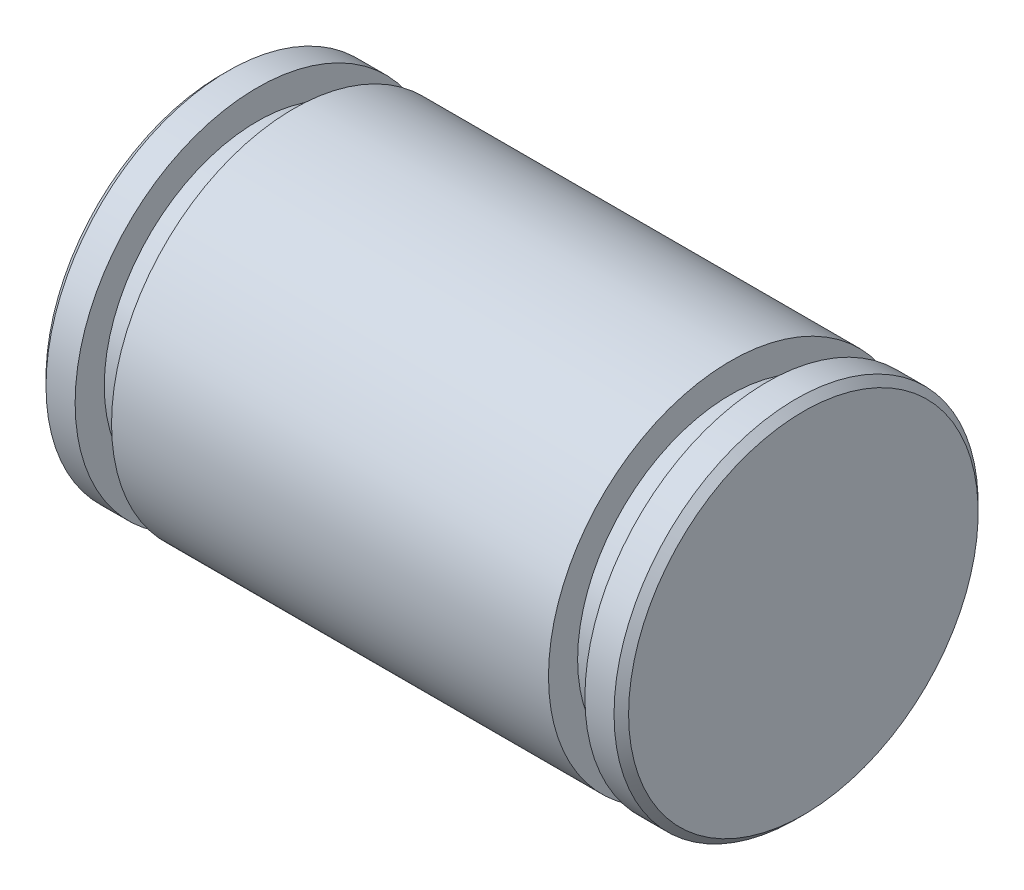
ISO-10303-21;
HEADER;
FILE_DESCRIPTION(('STEP AP214'),'2;1');
FILE_NAME('part.step','',(''),(''),'','','');
FILE_SCHEMA(('AUTOMOTIVE_DESIGN { 1 0 10303 214 1 1 1 1 }'));
ENDSEC;
DATA;
#1=APPLICATION_CONTEXT('core data for automotive mechanical design processes');
#2=APPLICATION_PROTOCOL_DEFINITION('international standard','automotive_design',2000,#1);
#3=PRODUCT_CONTEXT('',#1,'mechanical');
#4=PRODUCT('Part','Part','',(#3));
#5=PRODUCT_RELATED_PRODUCT_CATEGORY('part','',(#4));
#6=PRODUCT_DEFINITION_FORMATION('','',#4);
#7=PRODUCT_DEFINITION_CONTEXT('part definition',#1,'design');
#8=PRODUCT_DEFINITION('design','',#6,#7);
#9=PRODUCT_DEFINITION_SHAPE('','',#8);
#10=(LENGTH_UNIT() NAMED_UNIT(*) SI_UNIT(.MILLI.,.METRE.));
#11=(NAMED_UNIT(*) PLANE_ANGLE_UNIT() SI_UNIT($,.RADIAN.));
#12=(NAMED_UNIT(*) SI_UNIT($,.STERADIAN.) SOLID_ANGLE_UNIT());
#13=UNCERTAINTY_MEASURE_WITH_UNIT(LENGTH_MEASURE(1.E-05),#10,'distance_accuracy_value','');
#14=(GEOMETRIC_REPRESENTATION_CONTEXT(3) GLOBAL_UNCERTAINTY_ASSIGNED_CONTEXT((#13)) GLOBAL_UNIT_ASSIGNED_CONTEXT((#10,
#11,#12)) REPRESENTATION_CONTEXT('',''));
#15=CARTESIAN_POINT('',(0.,0.,0.));
#16=DIRECTION('',(0.,0.,1.));
#17=DIRECTION('',(1.,0.,0.));
#18=AXIS2_PLACEMENT_3D('',#15,#16,#17);
#19=CARTESIAN_POINT('',(16.,4.8,0.));
#20=DIRECTION('',(-1.,0.,0.));
#21=DIRECTION('',(0.,0.,1.));
#22=AXIS2_PLACEMENT_3D('',#19,#20,#21);
#23=PLANE('',#22);
#24=CARTESIAN_POINT('',(15.9999999999627,0.,0.));
#25=DIRECTION('',(-1.,0.,0.));
#26=DIRECTION('',(0.,0.,1.));
#27=AXIS2_PLACEMENT_3D('',#24,#25,#26);
#28=CIRCLE('',#27,4.80000000004566);
#29=CARTESIAN_POINT('',(15.9999999999627,0.,4.80000000004566));
#30=VERTEX_POINT('',#29);
#31=EDGE_CURVE('E17',#30,#30,#28,.T.);
#32=ORIENTED_EDGE('',*,*,#31,.F.);
#33=EDGE_LOOP('',(#32));
#34=FACE_BOUND('',#33,.T.);
#35=ADVANCED_FACE('F14',(#34),#23,.F.);
#36=CARTESIAN_POINT('',(0.,0.,0.));
#37=DIRECTION('',(1.,0.,0.));
#38=DIRECTION('',(0.,0.,-1.));
#39=AXIS2_PLACEMENT_3D('',#36,#37,#38);
#40=PLANE('',#39);
#41=CARTESIAN_POINT('',(5.6843418860808E-11,0.,0.));
#42=DIRECTION('',(1.,0.,0.));
#43=DIRECTION('',(0.,0.,-1.));
#44=AXIS2_PLACEMENT_3D('',#41,#42,#43);
#45=CIRCLE('',#44,4.79999999998881);
#46=CARTESIAN_POINT('',(5.6843418860808E-11,0.,-4.79999999998881));
#47=VERTEX_POINT('',#46);
#48=EDGE_CURVE('E49',#47,#47,#45,.T.);
#49=ORIENTED_EDGE('',*,*,#48,.F.);
#50=EDGE_LOOP('',(#49));
#51=FACE_BOUND('',#50,.T.);
#52=ADVANCED_FACE('F60',(#51),#40,.F.);
#53=CARTESIAN_POINT('',(15.7999999999561,0.,0.));
#54=DIRECTION('',(-1.,0.,0.));
#55=DIRECTION('',(0.,0.,1.));
#56=AXIS2_PLACEMENT_3D('',#53,#54,#55);
#57=CONICAL_SURFACE('',#56,5.0000000000523,0.785398163397448);
#58=CARTESIAN_POINT('',(15.8,0.,0.));
#59=DIRECTION('',(-1.,0.,0.));
#60=DIRECTION('',(0.,0.,1.));
#61=AXIS2_PLACEMENT_3D('',#58,#59,#60);
#62=CIRCLE('',#61,5.);
#63=CARTESIAN_POINT('',(15.8,0.,5.));
#64=VERTEX_POINT('',#63);
#65=EDGE_CURVE('E29',#64,#64,#62,.T.);
#66=ORIENTED_EDGE('',*,*,#65,.F.);
#67=EDGE_LOOP('',(#66));
#68=FACE_BOUND('',#67,.T.);
#69=ORIENTED_EDGE('',*,*,#31,.T.);
#70=EDGE_LOOP('',(#69));
#71=FACE_BOUND('',#70,.T.);
#72=ADVANCED_FACE('F57',(#68,#71),#57,.T.);
#73=CARTESIAN_POINT('',(0.200000000006639,0.,0.));
#74=DIRECTION('',(1.,0.,0.));
#75=DIRECTION('',(0.,0.,-1.));
#76=AXIS2_PLACEMENT_3D('',#73,#74,#75);
#77=CONICAL_SURFACE('',#76,4.99999999993861,0.785398163397448);
#78=CARTESIAN_POINT('',(0.200000000000006,0.,0.));
#79=DIRECTION('',(-1.,0.,0.));
#80=DIRECTION('',(0.,0.,1.));
#81=AXIS2_PLACEMENT_3D('',#78,#79,#80);
#82=CIRCLE('',#81,5.);
#83=CARTESIAN_POINT('',(0.200000000000006,0.,5.));
#84=VERTEX_POINT('',#83);
#85=EDGE_CURVE('E48',#84,#84,#82,.F.);
#86=ORIENTED_EDGE('',*,*,#85,.F.);
#87=EDGE_LOOP('',(#86));
#88=FACE_BOUND('',#87,.T.);
#89=ORIENTED_EDGE('',*,*,#48,.T.);
#90=EDGE_LOOP('',(#89));
#91=FACE_BOUND('',#90,.T.);
#92=ADVANCED_FACE('F105',(#88,#91),#77,.T.);
#93=CARTESIAN_POINT('',(-138.084352936582,0.,0.));
#94=DIRECTION('',(-1.,0.,0.));
#95=DIRECTION('',(0.,0.,1.));
#96=AXIS2_PLACEMENT_3D('',#93,#94,#95);
#97=CYLINDRICAL_SURFACE('',#96,5.);
#98=CARTESIAN_POINT('',(15.,0.,0.));
#99=DIRECTION('',(-1.,0.,0.));
#100=DIRECTION('',(0.,0.,1.));
#101=AXIS2_PLACEMENT_3D('',#98,#99,#100);
#102=CIRCLE('',#101,5.);
#103=CARTESIAN_POINT('',(15.,0.,5.));
#104=VERTEX_POINT('',#103);
#105=EDGE_CURVE('E46',#104,#104,#102,.F.);
#106=ORIENTED_EDGE('',*,*,#105,.T.);
#107=EDGE_LOOP('',(#106));
#108=FACE_BOUND('',#107,.T.);
#109=ORIENTED_EDGE('',*,*,#65,.T.);
#110=EDGE_LOOP('',(#109));
#111=FACE_BOUND('',#110,.T.);
#112=ADVANCED_FACE('F101',(#108,#111),#97,.T.);
#113=CARTESIAN_POINT('',(-138.084352936582,0.,0.));
#114=DIRECTION('',(-1.,0.,0.));
#115=DIRECTION('',(0.,0.,1.));
#116=AXIS2_PLACEMENT_3D('',#113,#114,#115);
#117=CYLINDRICAL_SURFACE('',#116,5.);
#118=ORIENTED_EDGE('',*,*,#85,.T.);
#119=EDGE_LOOP('',(#118));
#120=FACE_BOUND('',#119,.T.);
#121=CARTESIAN_POINT('',(1.,0.,0.));
#122=DIRECTION('',(-1.,0.,0.));
#123=DIRECTION('',(0.,0.,1.));
#124=AXIS2_PLACEMENT_3D('',#121,#122,#123);
#125=CIRCLE('',#124,5.);
#126=CARTESIAN_POINT('',(1.,0.,5.));
#127=VERTEX_POINT('',#126);
#128=EDGE_CURVE('E43',#127,#127,#125,.T.);
#129=ORIENTED_EDGE('',*,*,#128,.T.);
#130=EDGE_LOOP('',(#129));
#131=FACE_BOUND('',#130,.T.);
#132=ADVANCED_FACE('F97',(#120,#131),#117,.T.);
#133=CARTESIAN_POINT('',(15.,4.2,0.));
#134=DIRECTION('',(1.,0.,0.));
#135=DIRECTION('',(0.,0.,-1.));
#136=AXIS2_PLACEMENT_3D('',#133,#134,#135);
#137=PLANE('',#136);
#138=ORIENTED_EDGE('',*,*,#105,.F.);
#139=EDGE_LOOP('',(#138));
#140=FACE_BOUND('',#139,.T.);
#141=CARTESIAN_POINT('',(15.,0.,0.));
#142=DIRECTION('',(-1.,0.,0.));
#143=DIRECTION('',(0.,0.,1.));
#144=AXIS2_PLACEMENT_3D('',#141,#142,#143);
#145=CIRCLE('',#144,4.2);
#146=CARTESIAN_POINT('',(15.,0.,4.2));
#147=VERTEX_POINT('',#146);
#148=EDGE_CURVE('E40',#147,#147,#145,.T.);
#149=ORIENTED_EDGE('',*,*,#148,.F.);
#150=EDGE_LOOP('',(#149));
#151=FACE_BOUND('',#150,.T.);
#152=ADVANCED_FACE('F93',(#140,#151),#137,.F.);
#153=CARTESIAN_POINT('',(1.,5.,0.));
#154=DIRECTION('',(-1.,0.,0.));
#155=DIRECTION('',(0.,0.,1.));
#156=AXIS2_PLACEMENT_3D('',#153,#154,#155);
#157=PLANE('',#156);
#158=CARTESIAN_POINT('',(1.,0.,0.));
#159=DIRECTION('',(-1.,0.,0.));
#160=DIRECTION('',(0.,0.,1.));
#161=AXIS2_PLACEMENT_3D('',#158,#159,#160);
#162=CIRCLE('',#161,4.2);
#163=CARTESIAN_POINT('',(1.,0.,4.2));
#164=VERTEX_POINT('',#163);
#165=EDGE_CURVE('E37',#164,#164,#162,.F.);
#166=ORIENTED_EDGE('',*,*,#165,.F.);
#167=EDGE_LOOP('',(#166));
#168=FACE_BOUND('',#167,.T.);
#169=ORIENTED_EDGE('',*,*,#128,.F.);
#170=EDGE_LOOP('',(#169));
#171=FACE_BOUND('',#170,.T.);
#172=ADVANCED_FACE('F89',(#168,#171),#157,.F.);
#173=CARTESIAN_POINT('',(-138.084352936582,0.,0.));
#174=DIRECTION('',(-1.,0.,0.));
#175=DIRECTION('',(0.,0.,1.));
#176=AXIS2_PLACEMENT_3D('',#173,#174,#175);
#177=CYLINDRICAL_SURFACE('',#176,4.2);
#178=CARTESIAN_POINT('',(14.,0.,0.));
#179=DIRECTION('',(-1.,0.,0.));
#180=DIRECTION('',(0.,0.,1.));
#181=AXIS2_PLACEMENT_3D('',#178,#179,#180);
#182=CIRCLE('',#181,4.2);
#183=CARTESIAN_POINT('',(14.,0.,4.2));
#184=VERTEX_POINT('',#183);
#185=EDGE_CURVE('E34',#184,#184,#182,.F.);
#186=ORIENTED_EDGE('',*,*,#185,.T.);
#187=EDGE_LOOP('',(#186));
#188=FACE_BOUND('',#187,.T.);
#189=ORIENTED_EDGE('',*,*,#148,.T.);
#190=EDGE_LOOP('',(#189));
#191=FACE_BOUND('',#190,.T.);
#192=ADVANCED_FACE('F85',(#188,#191),#177,.T.);
#193=CARTESIAN_POINT('',(-138.084352936582,0.,0.));
#194=DIRECTION('',(-1.,0.,0.));
#195=DIRECTION('',(0.,0.,1.));
#196=AXIS2_PLACEMENT_3D('',#193,#194,#195);
#197=CYLINDRICAL_SURFACE('',#196,4.2);
#198=ORIENTED_EDGE('',*,*,#165,.T.);
#199=EDGE_LOOP('',(#198));
#200=FACE_BOUND('',#199,.T.);
#201=CARTESIAN_POINT('',(2.,0.,0.));
#202=DIRECTION('',(-1.,0.,0.));
#203=DIRECTION('',(0.,0.,1.));
#204=AXIS2_PLACEMENT_3D('',#201,#202,#203);
#205=CIRCLE('',#204,4.2);
#206=CARTESIAN_POINT('',(2.,0.,4.2));
#207=VERTEX_POINT('',#206);
#208=EDGE_CURVE('E26',#207,#207,#205,.T.);
#209=ORIENTED_EDGE('',*,*,#208,.T.);
#210=EDGE_LOOP('',(#209));
#211=FACE_BOUND('',#210,.T.);
#212=ADVANCED_FACE('F81',(#200,#211),#197,.T.);
#213=CARTESIAN_POINT('',(14.,5.,0.));
#214=DIRECTION('',(-1.,0.,0.));
#215=DIRECTION('',(0.,0.,1.));
#216=AXIS2_PLACEMENT_3D('',#213,#214,#215);
#217=PLANE('',#216);
#218=ORIENTED_EDGE('',*,*,#185,.F.);
#219=EDGE_LOOP('',(#218));
#220=FACE_BOUND('',#219,.T.);
#221=CARTESIAN_POINT('',(14.,0.,0.));
#222=DIRECTION('',(-1.,0.,0.));
#223=DIRECTION('',(0.,0.,1.));
#224=AXIS2_PLACEMENT_3D('',#221,#222,#223);
#225=CIRCLE('',#224,5.);
#226=CARTESIAN_POINT('',(14.,0.,5.));
#227=VERTEX_POINT('',#226);
#228=EDGE_CURVE('E21',#227,#227,#225,.T.);
#229=ORIENTED_EDGE('',*,*,#228,.F.);
#230=EDGE_LOOP('',(#229));
#231=FACE_BOUND('',#230,.T.);
#232=ADVANCED_FACE('F74',(#220,#231),#217,.F.);
#233=CARTESIAN_POINT('',(2.,4.2,0.));
#234=DIRECTION('',(1.,0.,0.));
#235=DIRECTION('',(0.,0.,-1.));
#236=AXIS2_PLACEMENT_3D('',#233,#234,#235);
#237=PLANE('',#236);
#238=CARTESIAN_POINT('',(2.,0.,0.));
#239=DIRECTION('',(-1.,0.,0.));
#240=DIRECTION('',(0.,0.,1.));
#241=AXIS2_PLACEMENT_3D('',#238,#239,#240);
#242=CIRCLE('',#241,5.);
#243=CARTESIAN_POINT('',(2.,0.,5.));
#244=VERTEX_POINT('',#243);
#245=EDGE_CURVE('E10',#244,#244,#242,.F.);
#246=ORIENTED_EDGE('',*,*,#245,.F.);
#247=EDGE_LOOP('',(#246));
#248=FACE_BOUND('',#247,.T.);
#249=ORIENTED_EDGE('',*,*,#208,.F.);
#250=EDGE_LOOP('',(#249));
#251=FACE_BOUND('',#250,.T.);
#252=ADVANCED_FACE('F68',(#248,#251),#237,.F.);
#253=CARTESIAN_POINT('',(-138.084352936582,0.,0.));
#254=DIRECTION('',(-1.,0.,0.));
#255=DIRECTION('',(0.,0.,1.));
#256=AXIS2_PLACEMENT_3D('',#253,#254,#255);
#257=CYLINDRICAL_SURFACE('',#256,5.);
#258=ORIENTED_EDGE('',*,*,#245,.T.);
#259=EDGE_LOOP('',(#258));
#260=FACE_BOUND('',#259,.T.);
#261=ORIENTED_EDGE('',*,*,#228,.T.);
#262=EDGE_LOOP('',(#261));
#263=FACE_BOUND('',#262,.T.);
#264=ADVANCED_FACE('F66',(#260,#263),#257,.T.);
#265=CLOSED_SHELL('',(#35,#52,#72,#92,#112,#132,#152,#172,#192,#212,#232,#252,#264));
#266=MANIFOLD_SOLID_BREP('B1',#265);
#267=ADVANCED_BREP_SHAPE_REPRESENTATION('',(#18,#266),#14);
#268=SHAPE_DEFINITION_REPRESENTATION(#9,#267);
ENDSEC;
END-ISO-10303-21;
